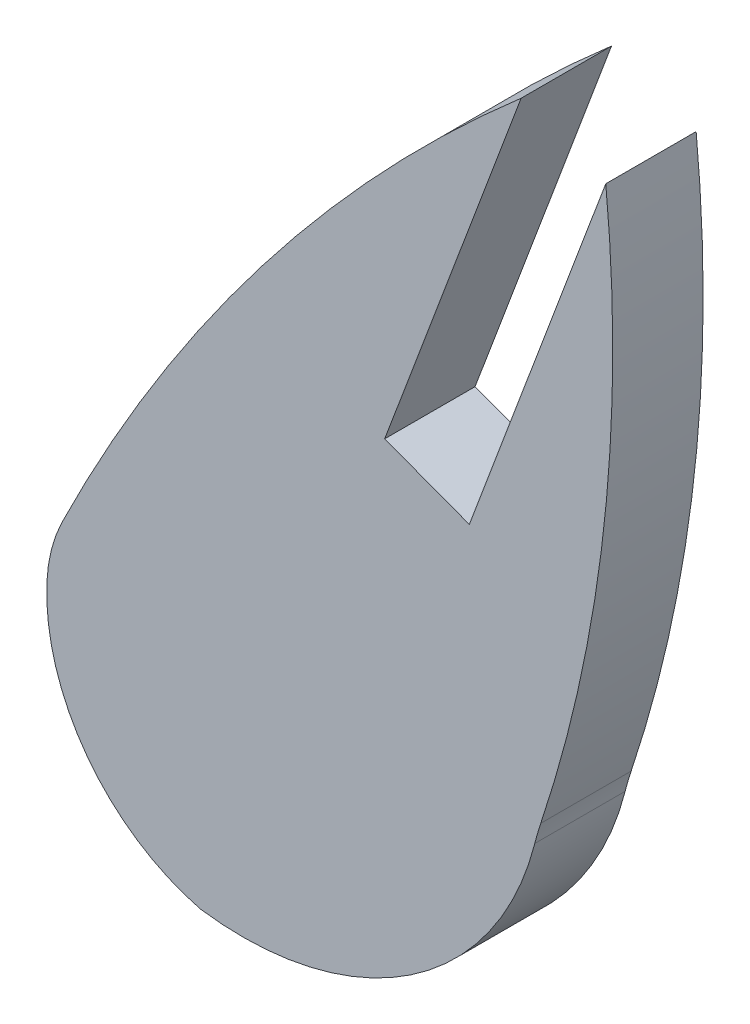
ISO-10303-21;
HEADER;
FILE_DESCRIPTION(('STEP AP214'),'2;1');
FILE_NAME('part.step','',(''),(''),'','','');
FILE_SCHEMA(('AUTOMOTIVE_DESIGN { 1 0 10303 214 1 1 1 1 }'));
ENDSEC;
DATA;
#1=APPLICATION_CONTEXT('core data for automotive mechanical design processes');
#2=APPLICATION_PROTOCOL_DEFINITION('international standard','automotive_design',2000,#1);
#3=PRODUCT_CONTEXT('',#1,'mechanical');
#4=PRODUCT('Part','Part','',(#3));
#5=PRODUCT_RELATED_PRODUCT_CATEGORY('part','',(#4));
#6=PRODUCT_DEFINITION_FORMATION('','',#4);
#7=PRODUCT_DEFINITION_CONTEXT('part definition',#1,'design');
#8=PRODUCT_DEFINITION('design','',#6,#7);
#9=PRODUCT_DEFINITION_SHAPE('','',#8);
#10=(LENGTH_UNIT() NAMED_UNIT(*) SI_UNIT(.MILLI.,.METRE.));
#11=(NAMED_UNIT(*) PLANE_ANGLE_UNIT() SI_UNIT($,.RADIAN.));
#12=(NAMED_UNIT(*) SI_UNIT($,.STERADIAN.) SOLID_ANGLE_UNIT());
#13=UNCERTAINTY_MEASURE_WITH_UNIT(LENGTH_MEASURE(1.E-05),#10,'distance_accuracy_value','');
#14=(GEOMETRIC_REPRESENTATION_CONTEXT(3) GLOBAL_UNCERTAINTY_ASSIGNED_CONTEXT((#13)) GLOBAL_UNIT_ASSIGNED_CONTEXT((#10,
#11,#12)) REPRESENTATION_CONTEXT('',''));
#15=CARTESIAN_POINT('',(0.,0.,0.));
#16=DIRECTION('',(0.,0.,1.));
#17=DIRECTION('',(1.,0.,0.));
#18=AXIS2_PLACEMENT_3D('',#15,#16,#17);
#19=CARTESIAN_POINT('',(-881.660993393996,-92.339258861489,3.));
#20=DIRECTION('',(0.,0.,-1.));
#21=DIRECTION('',(-1.,0.,0.));
#22=AXIS2_PLACEMENT_3D('',#19,#20,#21);
#23=CYLINDRICAL_SURFACE('',#22,47.0579792938459);
#24=CARTESIAN_POINT('',(-881.660993393996,-92.339258861489,0.));
#25=DIRECTION('',(0.,0.,1.));
#26=DIRECTION('',(1.,0.,0.));
#27=AXIS2_PLACEMENT_3D('',#24,#25,#26);
#28=CIRCLE('',#27,47.0579792938459);
#29=CARTESIAN_POINT('',(-836.992003912058,-107.142461011107,0.));
#30=VERTEX_POINT('',#29);
#31=CARTESIAN_POINT('',(-834.834343420026,-87.67897266477,0.));
#32=VERTEX_POINT('',#31);
#33=EDGE_CURVE('E136',#30,#32,#28,.T.);
#34=ORIENTED_EDGE('',*,*,#33,.T.);
#35=DIRECTION('',(0.,0.,-1.));
#36=VECTOR('',#35,1.);
#37=CARTESIAN_POINT('',(-834.834343420026,-87.67897266477,3.));
#38=LINE('',#37,#36);
#39=CARTESIAN_POINT('',(-834.834343420026,-87.67897266477,3.));
#40=VERTEX_POINT('',#39);
#41=EDGE_CURVE('E11',#40,#32,#38,.T.);
#42=ORIENTED_EDGE('',*,*,#41,.F.);
#43=CARTESIAN_POINT('',(-881.660993393996,-92.339258861489,3.));
#44=DIRECTION('',(0.,0.,1.));
#45=DIRECTION('',(1.,0.,0.));
#46=AXIS2_PLACEMENT_3D('',#43,#44,#45);
#47=CIRCLE('',#46,47.0579792938459);
#48=CARTESIAN_POINT('',(-836.992003912058,-107.142461011107,3.));
#49=VERTEX_POINT('',#48);
#50=EDGE_CURVE('E152',#49,#40,#47,.T.);
#51=ORIENTED_EDGE('',*,*,#50,.F.);
#52=DIRECTION('',(0.,0.,-1.));
#53=VECTOR('',#52,1.);
#54=CARTESIAN_POINT('',(-836.992003912058,-107.142461011107,3.));
#55=LINE('',#54,#53);
#56=EDGE_CURVE('E132',#49,#30,#55,.T.);
#57=ORIENTED_EDGE('',*,*,#56,.T.);
#58=EDGE_LOOP('',(#34,#42,#51,#57));
#59=FACE_BOUND('',#58,.T.);
#60=ADVANCED_FACE('F34',(#59),#23,.T.);
#61=CARTESIAN_POINT('',(-834.834343420026,-87.67897266477,3.));
#62=DIRECTION('',(0.936112926246517,-0.35169957252488,0.));
#63=DIRECTION('',(0.35169957252488,0.936112926246517,0.));
#64=AXIS2_PLACEMENT_3D('',#61,#62,#63);
#65=PLANE('',#64);
#66=DIRECTION('',(-0.35169957252488,-0.936112926246517,0.));
#67=VECTOR('',#66,1.);
#68=CARTESIAN_POINT('',(-834.834343420026,-87.67897266477,0.));
#69=LINE('',#68,#67);
#70=CARTESIAN_POINT('',(-839.364460389175,-99.7367099596548,0.));
#71=VERTEX_POINT('',#70);
#72=EDGE_CURVE('E139',#32,#71,#69,.T.);
#73=ORIENTED_EDGE('',*,*,#72,.T.);
#74=DIRECTION('',(0.,0.,-1.));
#75=VECTOR('',#74,1.);
#76=CARTESIAN_POINT('',(-839.364460389175,-99.7367099596548,3.));
#77=LINE('',#76,#75);
#78=CARTESIAN_POINT('',(-839.364460389175,-99.7367099596548,3.));
#79=VERTEX_POINT('',#78);
#80=EDGE_CURVE('E42',#79,#71,#77,.T.);
#81=ORIENTED_EDGE('',*,*,#80,.F.);
#82=DIRECTION('',(-0.35169957252488,-0.936112926246517,0.));
#83=VECTOR('',#82,1.);
#84=CARTESIAN_POINT('',(-834.834343420026,-87.67897266477,3.));
#85=LINE('',#84,#83);
#86=EDGE_CURVE('E96',#40,#79,#85,.T.);
#87=ORIENTED_EDGE('',*,*,#86,.F.);
#88=ORIENTED_EDGE('',*,*,#41,.T.);
#89=EDGE_LOOP('',(#73,#81,#87,#88));
#90=FACE_BOUND('',#89,.T.);
#91=ADVANCED_FACE('F195',(#90),#65,.F.);
#92=CARTESIAN_POINT('',(-839.364460389175,-99.7367099596548,3.));
#93=DIRECTION('',(-0.351699572524882,-0.936112926246516,0.));
#94=DIRECTION('',(0.936112926246516,-0.351699572524882,0.));
#95=AXIS2_PLACEMENT_3D('',#92,#93,#94);
#96=PLANE('',#95);
#97=DIRECTION('',(-0.936112926246516,0.351699572524882,0.));
#98=VECTOR('',#97,1.);
#99=CARTESIAN_POINT('',(-839.364460389175,-99.7367099596548,0.));
#100=LINE('',#99,#98);
#101=CARTESIAN_POINT('',(-842.172799167914,-98.6816112420802,0.));
#102=VERTEX_POINT('',#101);
#103=EDGE_CURVE('E141',#71,#102,#100,.T.);
#104=ORIENTED_EDGE('',*,*,#103,.T.);
#105=DIRECTION('',(0.,0.,-1.));
#106=VECTOR('',#105,1.);
#107=CARTESIAN_POINT('',(-842.172799167914,-98.6816112420802,3.));
#108=LINE('',#107,#106);
#109=CARTESIAN_POINT('',(-842.172799167914,-98.6816112420802,3.));
#110=VERTEX_POINT('',#109);
#111=EDGE_CURVE('E162',#110,#102,#108,.T.);
#112=ORIENTED_EDGE('',*,*,#111,.F.);
#113=DIRECTION('',(-0.936112926246516,0.351699572524882,0.));
#114=VECTOR('',#113,1.);
#115=CARTESIAN_POINT('',(-839.364460389175,-99.7367099596548,3.));
#116=LINE('',#115,#114);
#117=EDGE_CURVE('E170',#79,#110,#116,.T.);
#118=ORIENTED_EDGE('',*,*,#117,.F.);
#119=ORIENTED_EDGE('',*,*,#80,.T.);
#120=EDGE_LOOP('',(#104,#112,#118,#119));
#121=FACE_BOUND('',#120,.T.);
#122=ADVANCED_FACE('F168',(#121),#96,.F.);
#123=CARTESIAN_POINT('',(-842.172799167914,-98.6816112420802,3.));
#124=DIRECTION('',(-0.936112926246517,0.351699572524881,0.));
#125=DIRECTION('',(-0.351699572524881,-0.936112926246517,0.));
#126=AXIS2_PLACEMENT_3D('',#123,#124,#125);
#127=PLANE('',#126);
#128=DIRECTION('',(0.351699572524881,0.936112926246517,0.));
#129=VECTOR('',#128,1.);
#130=CARTESIAN_POINT('',(-842.172799167914,-98.6816112420802,0.));
#131=LINE('',#130,#129);
#132=CARTESIAN_POINT('',(-837.642682198766,-86.6238739471953,0.));
#133=VERTEX_POINT('',#132);
#134=EDGE_CURVE('E143',#102,#133,#131,.T.);
#135=ORIENTED_EDGE('',*,*,#134,.T.);
#136=DIRECTION('',(0.,0.,-1.));
#137=VECTOR('',#136,1.);
#138=CARTESIAN_POINT('',(-837.642682198766,-86.6238739471953,3.));
#139=LINE('',#138,#137);
#140=CARTESIAN_POINT('',(-837.642682198766,-86.6238739471953,3.));
#141=VERTEX_POINT('',#140);
#142=EDGE_CURVE('E159',#141,#133,#139,.T.);
#143=ORIENTED_EDGE('',*,*,#142,.F.);
#144=DIRECTION('',(0.351699572524881,0.936112926246517,0.));
#145=VECTOR('',#144,1.);
#146=CARTESIAN_POINT('',(-842.172799167914,-98.6816112420802,3.));
#147=LINE('',#146,#145);
#148=EDGE_CURVE('E186',#110,#141,#147,.T.);
#149=ORIENTED_EDGE('',*,*,#148,.F.);
#150=ORIENTED_EDGE('',*,*,#111,.T.);
#151=EDGE_LOOP('',(#135,#143,#149,#150));
#152=FACE_BOUND('',#151,.T.);
#153=ADVANCED_FACE('F179',(#152),#127,.F.);
#154=CARTESIAN_POINT('',(-796.449004153568,-134.082653367293,3.));
#155=DIRECTION('',(0.,0.,-1.));
#156=DIRECTION('',(-1.,0.,0.));
#157=AXIS2_PLACEMENT_3D('',#154,#155,#156);
#158=CYLINDRICAL_SURFACE('',#157,62.8430971144558);
#159=CARTESIAN_POINT('',(-796.449004153568,-134.082653367293,0.));
#160=DIRECTION('',(0.,0.,1.));
#161=DIRECTION('',(-1.,0.,0.));
#162=AXIS2_PLACEMENT_3D('',#159,#160,#161);
#163=CIRCLE('',#162,62.8430971144558);
#164=CARTESIAN_POINT('',(-852.880224120933,-106.428137136995,0.));
#165=VERTEX_POINT('',#164);
#166=EDGE_CURVE('E145',#133,#165,#163,.T.);
#167=ORIENTED_EDGE('',*,*,#166,.T.);
#168=DIRECTION('',(0.,0.,-1.));
#169=VECTOR('',#168,1.);
#170=CARTESIAN_POINT('',(-852.880224120933,-106.428137136995,3.));
#171=LINE('',#170,#169);
#172=CARTESIAN_POINT('',(-852.880224120933,-106.428137136995,3.));
#173=VERTEX_POINT('',#172);
#174=EDGE_CURVE('E156',#173,#165,#171,.T.);
#175=ORIENTED_EDGE('',*,*,#174,.F.);
#176=CARTESIAN_POINT('',(-796.449004153568,-134.082653367293,3.));
#177=DIRECTION('',(0.,0.,1.));
#178=DIRECTION('',(-1.,0.,0.));
#179=AXIS2_PLACEMENT_3D('',#176,#177,#178);
#180=CIRCLE('',#179,62.8430971144558);
#181=EDGE_CURVE('E185',#141,#173,#180,.T.);
#182=ORIENTED_EDGE('',*,*,#181,.F.);
#183=ORIENTED_EDGE('',*,*,#142,.T.);
#184=EDGE_LOOP('',(#167,#175,#182,#183));
#185=FACE_BOUND('',#184,.T.);
#186=ADVANCED_FACE('F183',(#185),#158,.T.);
#187=CARTESIAN_POINT('',(-848.390373798583,-108.62841986494,3.));
#188=DIRECTION('',(0.,0.,-1.));
#189=DIRECTION('',(-1.,0.,0.));
#190=AXIS2_PLACEMENT_3D('',#187,#188,#189);
#191=CYLINDRICAL_SURFACE('',#190,5.00000000000023);
#192=CARTESIAN_POINT('',(-848.390373798583,-108.62841986494,0.));
#193=DIRECTION('',(0.,0.,1.));
#194=DIRECTION('',(-1.,0.,0.));
#195=AXIS2_PLACEMENT_3D('',#192,#193,#194);
#196=CIRCLE('',#195,5.00000000000023);
#197=CARTESIAN_POINT('',(-853.386054738141,-108.420641256476,0.));
#198=VERTEX_POINT('',#197);
#199=EDGE_CURVE('E147',#165,#198,#196,.T.);
#200=ORIENTED_EDGE('',*,*,#199,.T.);
#201=DIRECTION('',(0.,0.,-1.));
#202=VECTOR('',#201,1.);
#203=CARTESIAN_POINT('',(-853.386054738141,-108.420641256476,3.));
#204=LINE('',#203,#202);
#205=CARTESIAN_POINT('',(-853.386054738141,-108.420641256476,3.));
#206=VERTEX_POINT('',#205);
#207=EDGE_CURVE('E127',#206,#198,#204,.T.);
#208=ORIENTED_EDGE('',*,*,#207,.F.);
#209=CARTESIAN_POINT('',(-848.390373798583,-108.62841986494,3.));
#210=DIRECTION('',(0.,0.,1.));
#211=DIRECTION('',(-1.,0.,0.));
#212=AXIS2_PLACEMENT_3D('',#209,#210,#211);
#213=CIRCLE('',#212,5.00000000000023);
#214=EDGE_CURVE('E118',#173,#206,#213,.T.);
#215=ORIENTED_EDGE('',*,*,#214,.F.);
#216=ORIENTED_EDGE('',*,*,#174,.T.);
#217=EDGE_LOOP('',(#200,#208,#215,#216));
#218=FACE_BOUND('',#217,.T.);
#219=ADVANCED_FACE('F207',(#218),#191,.T.);
#220=CARTESIAN_POINT('',(-846.630209496511,-108.701628000883,3.));
#221=DIRECTION('',(0.,0.,-1.));
#222=DIRECTION('',(-1.,0.,0.));
#223=AXIS2_PLACEMENT_3D('',#220,#221,#222);
#224=CYLINDRICAL_SURFACE('',#223,6.76168606779278);
#225=CARTESIAN_POINT('',(-846.630209496511,-108.701628000883,0.));
#226=DIRECTION('',(0.,0.,1.));
#227=DIRECTION('',(-1.,0.,0.));
#228=AXIS2_PLACEMENT_3D('',#225,#226,#227);
#229=CIRCLE('',#228,6.76168606779278);
#230=CARTESIAN_POINT('',(-848.28149683297,-115.258582218493,0.));
#231=VERTEX_POINT('',#230);
#232=EDGE_CURVE('E126',#198,#231,#229,.T.);
#233=ORIENTED_EDGE('',*,*,#232,.T.);
#234=DIRECTION('',(0.,0.,-1.));
#235=VECTOR('',#234,1.);
#236=CARTESIAN_POINT('',(-848.28149683297,-115.258582218493,3.));
#237=LINE('',#236,#235);
#238=CARTESIAN_POINT('',(-848.28149683297,-115.258582218493,3.));
#239=VERTEX_POINT('',#238);
#240=EDGE_CURVE('E123',#239,#231,#237,.T.);
#241=ORIENTED_EDGE('',*,*,#240,.F.);
#242=CARTESIAN_POINT('',(-846.630209496511,-108.701628000883,3.));
#243=DIRECTION('',(0.,0.,1.));
#244=DIRECTION('',(-1.,0.,0.));
#245=AXIS2_PLACEMENT_3D('',#242,#243,#244);
#246=CIRCLE('',#245,6.76168606779278);
#247=EDGE_CURVE('E112',#206,#239,#246,.T.);
#248=ORIENTED_EDGE('',*,*,#247,.F.);
#249=ORIENTED_EDGE('',*,*,#207,.T.);
#250=EDGE_LOOP('',(#233,#241,#248,#249));
#251=FACE_BOUND('',#250,.T.);
#252=ADVANCED_FACE('F124',(#251),#224,.T.);
#253=CARTESIAN_POINT('',(-846.882215697184,-105.35696556751,3.));
#254=DIRECTION('',(0.,0.,-1.));
#255=DIRECTION('',(-1.,0.,0.));
#256=AXIS2_PLACEMENT_3D('',#253,#254,#255);
#257=CYLINDRICAL_SURFACE('',#256,9.99999999999997);
#258=CARTESIAN_POINT('',(-846.882215697184,-105.35696556751,0.));
#259=DIRECTION('',(0.,0.,1.));
#260=DIRECTION('',(1.,0.,0.));
#261=AXIS2_PLACEMENT_3D('',#258,#259,#260);
#262=CIRCLE('',#261,9.99999999999997);
#263=CARTESIAN_POINT('',(-837.190944525932,-107.822581734974,0.));
#264=VERTEX_POINT('',#263);
#265=EDGE_CURVE('E82',#231,#264,#262,.T.);
#266=ORIENTED_EDGE('',*,*,#265,.T.);
#267=DIRECTION('',(0.,0.,-1.));
#268=VECTOR('',#267,1.);
#269=CARTESIAN_POINT('',(-837.190944525932,-107.822581734974,3.));
#270=LINE('',#269,#268);
#271=CARTESIAN_POINT('',(-837.190944525932,-107.822581734974,3.));
#272=VERTEX_POINT('',#271);
#273=EDGE_CURVE('E128',#272,#264,#270,.T.);
#274=ORIENTED_EDGE('',*,*,#273,.F.);
#275=CARTESIAN_POINT('',(-846.882215697184,-105.35696556751,3.));
#276=DIRECTION('',(0.,0.,1.));
#277=DIRECTION('',(1.,0.,0.));
#278=AXIS2_PLACEMENT_3D('',#275,#276,#277);
#279=CIRCLE('',#278,9.99999999999997);
#280=EDGE_CURVE('E116',#239,#272,#279,.T.);
#281=ORIENTED_EDGE('',*,*,#280,.F.);
#282=ORIENTED_EDGE('',*,*,#240,.T.);
#283=EDGE_LOOP('',(#266,#274,#281,#282));
#284=FACE_BOUND('',#283,.T.);
#285=ADVANCED_FACE('F130',(#284),#257,.T.);
#286=CARTESIAN_POINT('',(-827.49967335468,-110.288197902439,3.));
#287=DIRECTION('',(0.,0.,-1.));
#288=DIRECTION('',(-1.,0.,0.));
#289=AXIS2_PLACEMENT_3D('',#286,#287,#288);
#290=CYLINDRICAL_SURFACE('',#289,10.0000000000001);
#291=CARTESIAN_POINT('',(-827.49967335468,-110.288197902439,0.));
#292=DIRECTION('',(0.,0.,-1.));
#293=DIRECTION('',(1.,0.,0.));
#294=AXIS2_PLACEMENT_3D('',#291,#292,#293);
#295=CIRCLE('',#294,10.0000000000001);
#296=EDGE_CURVE('E88',#264,#30,#295,.T.);
#297=ORIENTED_EDGE('',*,*,#296,.T.);
#298=ORIENTED_EDGE('',*,*,#56,.F.);
#299=CARTESIAN_POINT('',(-827.49967335468,-110.288197902439,3.));
#300=DIRECTION('',(0.,0.,-1.));
#301=DIRECTION('',(1.,0.,0.));
#302=AXIS2_PLACEMENT_3D('',#299,#300,#301);
#303=CIRCLE('',#302,10.0000000000001);
#304=EDGE_CURVE('E50',#272,#49,#303,.T.);
#305=ORIENTED_EDGE('',*,*,#304,.F.);
#306=ORIENTED_EDGE('',*,*,#273,.T.);
#307=EDGE_LOOP('',(#297,#298,#305,#306));
#308=FACE_BOUND('',#307,.T.);
#309=ADVANCED_FACE('F215',(#308),#290,.F.);
#310=CARTESIAN_POINT('',(-881.660993393996,-92.339258861489,3.));
#311=DIRECTION('',(0.,0.,1.));
#312=DIRECTION('',(1.,0.,0.));
#313=AXIS2_PLACEMENT_3D('',#310,#311,#312);
#314=PLANE('',#313);
#315=ORIENTED_EDGE('',*,*,#50,.T.);
#316=ORIENTED_EDGE('',*,*,#86,.T.);
#317=ORIENTED_EDGE('',*,*,#117,.T.);
#318=ORIENTED_EDGE('',*,*,#148,.T.);
#319=ORIENTED_EDGE('',*,*,#181,.T.);
#320=ORIENTED_EDGE('',*,*,#214,.T.);
#321=ORIENTED_EDGE('',*,*,#247,.T.);
#322=ORIENTED_EDGE('',*,*,#280,.T.);
#323=ORIENTED_EDGE('',*,*,#304,.T.);
#324=EDGE_LOOP('',(#315,#316,#317,#318,#319,#320,#321,#322,#323));
#325=FACE_BOUND('',#324,.T.);
#326=ADVANCED_FACE('F114',(#325),#314,.T.);
#327=CARTESIAN_POINT('',(-881.660993393996,-92.339258861489,0.));
#328=DIRECTION('',(0.,0.,1.));
#329=DIRECTION('',(1.,0.,0.));
#330=AXIS2_PLACEMENT_3D('',#327,#328,#329);
#331=PLANE('',#330);
#332=ORIENTED_EDGE('',*,*,#33,.F.);
#333=ORIENTED_EDGE('',*,*,#296,.F.);
#334=ORIENTED_EDGE('',*,*,#265,.F.);
#335=ORIENTED_EDGE('',*,*,#232,.F.);
#336=ORIENTED_EDGE('',*,*,#199,.F.);
#337=ORIENTED_EDGE('',*,*,#166,.F.);
#338=ORIENTED_EDGE('',*,*,#134,.F.);
#339=ORIENTED_EDGE('',*,*,#103,.F.);
#340=ORIENTED_EDGE('',*,*,#72,.F.);
#341=EDGE_LOOP('',(#332,#333,#334,#335,#336,#337,#338,#339,#340));
#342=FACE_BOUND('',#341,.T.);
#343=ADVANCED_FACE('F174',(#342),#331,.F.);
#344=CLOSED_SHELL('',(#60,#91,#122,#153,#186,#219,#252,#285,#309,#326,#343));
#345=MANIFOLD_SOLID_BREP('B2',#344);
#346=ADVANCED_BREP_SHAPE_REPRESENTATION('',(#18,#345),#14);
#347=SHAPE_DEFINITION_REPRESENTATION(#9,#346);
ENDSEC;
END-ISO-10303-21;
